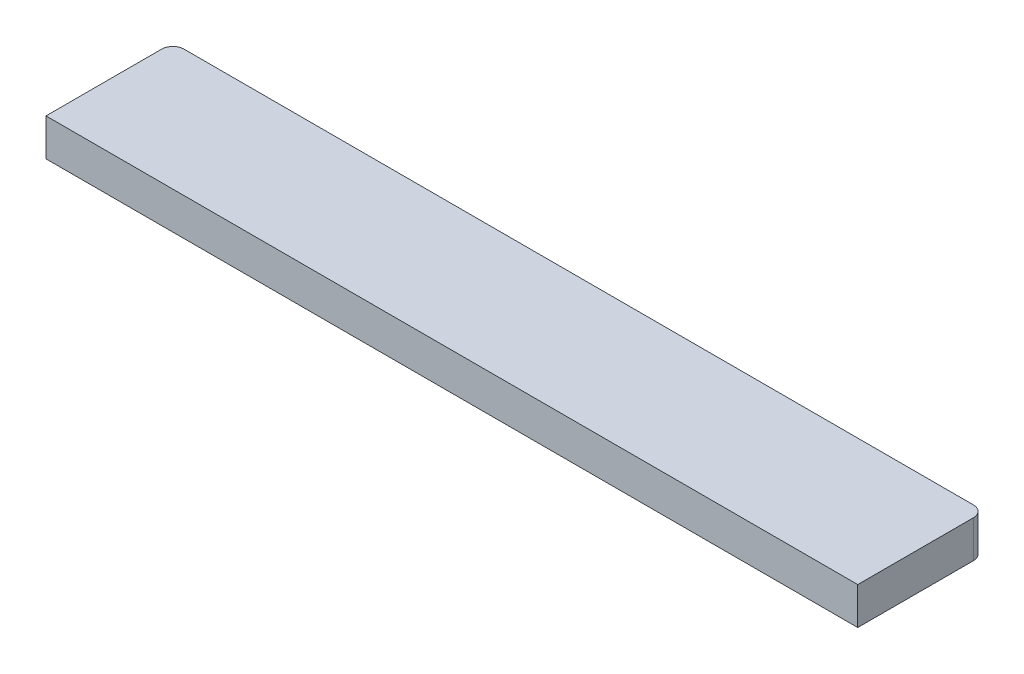
ISO-10303-21;
HEADER;
FILE_DESCRIPTION(('STEP AP214'),'2;1');
FILE_NAME('part.step','',(''),(''),'','','');
FILE_SCHEMA(('AUTOMOTIVE_DESIGN { 1 0 10303 214 1 1 1 1 }'));
ENDSEC;
DATA;
#1=APPLICATION_CONTEXT('core data for automotive mechanical design processes');
#2=APPLICATION_PROTOCOL_DEFINITION('international standard','automotive_design',2000,#1);
#3=PRODUCT_CONTEXT('',#1,'mechanical');
#4=PRODUCT('Part','Part','',(#3));
#5=PRODUCT_RELATED_PRODUCT_CATEGORY('part','',(#4));
#6=PRODUCT_DEFINITION_FORMATION('','',#4);
#7=PRODUCT_DEFINITION_CONTEXT('part definition',#1,'design');
#8=PRODUCT_DEFINITION('design','',#6,#7);
#9=PRODUCT_DEFINITION_SHAPE('','',#8);
#10=(LENGTH_UNIT() NAMED_UNIT(*) SI_UNIT(.MILLI.,.METRE.));
#11=(NAMED_UNIT(*) PLANE_ANGLE_UNIT() SI_UNIT($,.RADIAN.));
#12=(NAMED_UNIT(*) SI_UNIT($,.STERADIAN.) SOLID_ANGLE_UNIT());
#13=UNCERTAINTY_MEASURE_WITH_UNIT(LENGTH_MEASURE(1.E-05),#10,'distance_accuracy_value','');
#14=(GEOMETRIC_REPRESENTATION_CONTEXT(3) GLOBAL_UNCERTAINTY_ASSIGNED_CONTEXT((#13)) GLOBAL_UNIT_ASSIGNED_CONTEXT((#10,
#11,#12)) REPRESENTATION_CONTEXT('',''));
#15=CARTESIAN_POINT('',(0.,0.,0.));
#16=DIRECTION('',(0.,0.,1.));
#17=DIRECTION('',(1.,0.,0.));
#18=AXIS2_PLACEMENT_3D('',#15,#16,#17);
#19=CARTESIAN_POINT('',(0.,10.,0.));
#20=DIRECTION('',(1.,0.,0.));
#21=DIRECTION('',(0.,0.,-1.));
#22=AXIS2_PLACEMENT_3D('',#19,#20,#21);
#23=PLANE('',#22);
#24=DIRECTION('',(0.,0.,1.));
#25=VECTOR('',#24,1.);
#26=CARTESIAN_POINT('',(0.,10.,0.));
#27=LINE('',#26,#25);
#28=CARTESIAN_POINT('',(0.,10.,3.));
#29=VERTEX_POINT('',#28);
#30=CARTESIAN_POINT('',(0.,10.,34.06));
#31=VERTEX_POINT('',#30);
#32=EDGE_CURVE('E88',#29,#31,#27,.T.);
#33=ORIENTED_EDGE('',*,*,#32,.F.);
#34=DIRECTION('',(0.,-1.,0.));
#35=VECTOR('',#34,1.);
#36=CARTESIAN_POINT('',(0.,10.,3.));
#37=LINE('',#36,#35);
#38=CARTESIAN_POINT('',(0.,0.,3.));
#39=VERTEX_POINT('',#38);
#40=EDGE_CURVE('E111',#29,#39,#37,.T.);
#41=ORIENTED_EDGE('',*,*,#40,.T.);
#42=DIRECTION('',(0.,0.,1.));
#43=VECTOR('',#42,1.);
#44=CARTESIAN_POINT('',(0.,0.,0.));
#45=LINE('',#44,#43);
#46=CARTESIAN_POINT('',(0.,0.,34.06));
#47=VERTEX_POINT('',#46);
#48=EDGE_CURVE('E109',#39,#47,#45,.T.);
#49=ORIENTED_EDGE('',*,*,#48,.T.);
#50=DIRECTION('',(0.,-1.,0.));
#51=VECTOR('',#50,1.);
#52=CARTESIAN_POINT('',(0.,10.,34.06));
#53=LINE('',#52,#51);
#54=EDGE_CURVE('E103',#31,#47,#53,.T.);
#55=ORIENTED_EDGE('',*,*,#54,.F.);
#56=EDGE_LOOP('',(#33,#41,#49,#55));
#57=FACE_BOUND('',#56,.T.);
#58=ADVANCED_FACE('F34',(#57),#23,.F.);
#59=CARTESIAN_POINT('',(0.,10.,34.06));
#60=DIRECTION('',(0.,0.,-1.));
#61=DIRECTION('',(-1.,0.,0.));
#62=AXIS2_PLACEMENT_3D('',#59,#60,#61);
#63=PLANE('',#62);
#64=DIRECTION('',(1.,0.,0.));
#65=VECTOR('',#64,1.);
#66=CARTESIAN_POINT('',(0.,0.,34.06));
#67=LINE('',#66,#65);
#68=CARTESIAN_POINT('',(218.,0.,34.06));
#69=VERTEX_POINT('',#68);
#70=EDGE_CURVE('E138',#47,#69,#67,.T.);
#71=ORIENTED_EDGE('',*,*,#70,.T.);
#72=DIRECTION('',(0.,-1.,0.));
#73=VECTOR('',#72,1.);
#74=CARTESIAN_POINT('',(218.,10.,34.06));
#75=LINE('',#74,#73);
#76=CARTESIAN_POINT('',(218.,10.,34.06));
#77=VERTEX_POINT('',#76);
#78=EDGE_CURVE('E105',#77,#69,#75,.T.);
#79=ORIENTED_EDGE('',*,*,#78,.F.);
#80=DIRECTION('',(1.,0.,0.));
#81=VECTOR('',#80,1.);
#82=CARTESIAN_POINT('',(0.,10.,34.06));
#83=LINE('',#82,#81);
#84=EDGE_CURVE('E91',#31,#77,#83,.T.);
#85=ORIENTED_EDGE('',*,*,#84,.F.);
#86=ORIENTED_EDGE('',*,*,#54,.T.);
#87=EDGE_LOOP('',(#71,#79,#85,#86));
#88=FACE_BOUND('',#87,.T.);
#89=ADVANCED_FACE('F102',(#88),#63,.F.);
#90=CARTESIAN_POINT('',(218.,10.,0.));
#91=DIRECTION('',(-1.,0.,0.));
#92=DIRECTION('',(0.,0.,1.));
#93=AXIS2_PLACEMENT_3D('',#90,#91,#92);
#94=PLANE('',#93);
#95=DIRECTION('',(0.,0.,-1.));
#96=VECTOR('',#95,1.);
#97=CARTESIAN_POINT('',(218.,0.,0.));
#98=LINE('',#97,#96);
#99=CARTESIAN_POINT('',(218.,0.,3.));
#100=VERTEX_POINT('',#99);
#101=EDGE_CURVE('E136',#69,#100,#98,.T.);
#102=ORIENTED_EDGE('',*,*,#101,.T.);
#103=DIRECTION('',(0.,-1.,0.));
#104=VECTOR('',#103,1.);
#105=CARTESIAN_POINT('',(218.,10.,3.));
#106=LINE('',#105,#104);
#107=CARTESIAN_POINT('',(218.,10.,3.));
#108=VERTEX_POINT('',#107);
#109=EDGE_CURVE('E11',#100,#108,#106,.F.);
#110=ORIENTED_EDGE('',*,*,#109,.T.);
#111=DIRECTION('',(0.,0.,-1.));
#112=VECTOR('',#111,1.);
#113=CARTESIAN_POINT('',(218.,10.,0.));
#114=LINE('',#113,#112);
#115=EDGE_CURVE('E106',#77,#108,#114,.T.);
#116=ORIENTED_EDGE('',*,*,#115,.F.);
#117=ORIENTED_EDGE('',*,*,#78,.T.);
#118=EDGE_LOOP('',(#102,#110,#116,#117));
#119=FACE_BOUND('',#118,.T.);
#120=ADVANCED_FACE('F137',(#119),#94,.F.);
#121=CARTESIAN_POINT('',(0.,10.,0.));
#122=DIRECTION('',(0.,0.,1.));
#123=DIRECTION('',(1.,0.,0.));
#124=AXIS2_PLACEMENT_3D('',#121,#122,#123);
#125=PLANE('',#124);
#126=DIRECTION('',(-1.,0.,0.));
#127=VECTOR('',#126,1.);
#128=CARTESIAN_POINT('',(0.,0.,0.));
#129=LINE('',#128,#127);
#130=CARTESIAN_POINT('',(215.,0.,0.));
#131=VERTEX_POINT('',#130);
#132=CARTESIAN_POINT('',(3.,0.,0.));
#133=VERTEX_POINT('',#132);
#134=EDGE_CURVE('E98',#131,#133,#129,.T.);
#135=ORIENTED_EDGE('',*,*,#134,.T.);
#136=DIRECTION('',(0.,-1.,0.));
#137=VECTOR('',#136,1.);
#138=CARTESIAN_POINT('',(3.,10.,0.));
#139=LINE('',#138,#137);
#140=CARTESIAN_POINT('',(3.,10.,0.));
#141=VERTEX_POINT('',#140);
#142=EDGE_CURVE('E55',#133,#141,#139,.F.);
#143=ORIENTED_EDGE('',*,*,#142,.T.);
#144=DIRECTION('',(-1.,0.,0.));
#145=VECTOR('',#144,1.);
#146=CARTESIAN_POINT('',(0.,10.,0.));
#147=LINE('',#146,#145);
#148=CARTESIAN_POINT('',(215.,10.,0.));
#149=VERTEX_POINT('',#148);
#150=EDGE_CURVE('E115',#149,#141,#147,.T.);
#151=ORIENTED_EDGE('',*,*,#150,.F.);
#152=DIRECTION('',(0.,-1.,0.));
#153=VECTOR('',#152,1.);
#154=CARTESIAN_POINT('',(215.,10.,0.));
#155=LINE('',#154,#153);
#156=EDGE_CURVE('E122',#149,#131,#155,.T.);
#157=ORIENTED_EDGE('',*,*,#156,.T.);
#158=EDGE_LOOP('',(#135,#143,#151,#157));
#159=FACE_BOUND('',#158,.T.);
#160=ADVANCED_FACE('F130',(#159),#125,.F.);
#161=CARTESIAN_POINT('',(0.,10.,0.));
#162=DIRECTION('',(0.,1.,0.));
#163=DIRECTION('',(0.,0.,1.));
#164=AXIS2_PLACEMENT_3D('',#161,#162,#163);
#165=PLANE('',#164);
#166=ORIENTED_EDGE('',*,*,#150,.T.);
#167=CARTESIAN_POINT('',(3.,10.,3.));
#168=DIRECTION('',(0.,1.,0.));
#169=DIRECTION('',(0.,0.,1.));
#170=AXIS2_PLACEMENT_3D('',#167,#168,#169);
#171=CIRCLE('',#170,3.);
#172=EDGE_CURVE('E42',#141,#29,#171,.T.);
#173=ORIENTED_EDGE('',*,*,#172,.T.);
#174=ORIENTED_EDGE('',*,*,#32,.T.);
#175=ORIENTED_EDGE('',*,*,#84,.T.);
#176=ORIENTED_EDGE('',*,*,#115,.T.);
#177=CARTESIAN_POINT('',(215.,10.,3.));
#178=DIRECTION('',(0.,1.,0.));
#179=DIRECTION('',(0.,0.,1.));
#180=AXIS2_PLACEMENT_3D('',#177,#178,#179);
#181=CIRCLE('',#180,3.);
#182=EDGE_CURVE('E126',#108,#149,#181,.T.);
#183=ORIENTED_EDGE('',*,*,#182,.T.);
#184=EDGE_LOOP('',(#166,#173,#174,#175,#176,#183));
#185=FACE_BOUND('',#184,.T.);
#186=ADVANCED_FACE('F90',(#185),#165,.T.);
#187=CARTESIAN_POINT('',(0.,0.,0.));
#188=DIRECTION('',(0.,1.,0.));
#189=DIRECTION('',(0.,0.,1.));
#190=AXIS2_PLACEMENT_3D('',#187,#188,#189);
#191=PLANE('',#190);
#192=ORIENTED_EDGE('',*,*,#48,.F.);
#193=CARTESIAN_POINT('',(3.,0.,3.));
#194=DIRECTION('',(0.,1.,0.));
#195=DIRECTION('',(0.,0.,1.));
#196=AXIS2_PLACEMENT_3D('',#193,#194,#195);
#197=CIRCLE('',#196,3.);
#198=EDGE_CURVE('E120',#39,#133,#197,.F.);
#199=ORIENTED_EDGE('',*,*,#198,.T.);
#200=ORIENTED_EDGE('',*,*,#134,.F.);
#201=CARTESIAN_POINT('',(215.,0.,3.));
#202=DIRECTION('',(0.,1.,0.));
#203=DIRECTION('',(0.,0.,1.));
#204=AXIS2_PLACEMENT_3D('',#201,#202,#203);
#205=CIRCLE('',#204,3.);
#206=EDGE_CURVE('E113',#131,#100,#205,.F.);
#207=ORIENTED_EDGE('',*,*,#206,.T.);
#208=ORIENTED_EDGE('',*,*,#101,.F.);
#209=ORIENTED_EDGE('',*,*,#70,.F.);
#210=EDGE_LOOP('',(#192,#199,#200,#207,#208,#209));
#211=FACE_BOUND('',#210,.T.);
#212=ADVANCED_FACE('F135',(#211),#191,.F.);
#213=CARTESIAN_POINT('',(3.,10.,3.));
#214=DIRECTION('',(0.,-1.,0.));
#215=DIRECTION('',(0.,0.,-1.));
#216=AXIS2_PLACEMENT_3D('',#213,#214,#215);
#217=CYLINDRICAL_SURFACE('',#216,3.);
#218=ORIENTED_EDGE('',*,*,#172,.F.);
#219=ORIENTED_EDGE('',*,*,#142,.F.);
#220=ORIENTED_EDGE('',*,*,#198,.F.);
#221=ORIENTED_EDGE('',*,*,#40,.F.);
#222=EDGE_LOOP('',(#218,#219,#220,#221));
#223=FACE_BOUND('',#222,.T.);
#224=ADVANCED_FACE('F144',(#223),#217,.T.);
#225=CARTESIAN_POINT('',(215.,10.,3.));
#226=DIRECTION('',(0.,-1.,0.));
#227=DIRECTION('',(0.,0.,-1.));
#228=AXIS2_PLACEMENT_3D('',#225,#226,#227);
#229=CYLINDRICAL_SURFACE('',#228,3.);
#230=ORIENTED_EDGE('',*,*,#182,.F.);
#231=ORIENTED_EDGE('',*,*,#109,.F.);
#232=ORIENTED_EDGE('',*,*,#206,.F.);
#233=ORIENTED_EDGE('',*,*,#156,.F.);
#234=EDGE_LOOP('',(#230,#231,#232,#233));
#235=FACE_BOUND('',#234,.T.);
#236=ADVANCED_FACE('F36',(#235),#229,.T.);
#237=CLOSED_SHELL('',(#58,#89,#120,#160,#186,#212,#224,#236));
#238=MANIFOLD_SOLID_BREP('B2',#237);
#239=ADVANCED_BREP_SHAPE_REPRESENTATION('',(#18,#238),#14);
#240=SHAPE_DEFINITION_REPRESENTATION(#9,#239);
ENDSEC;
END-ISO-10303-21;
